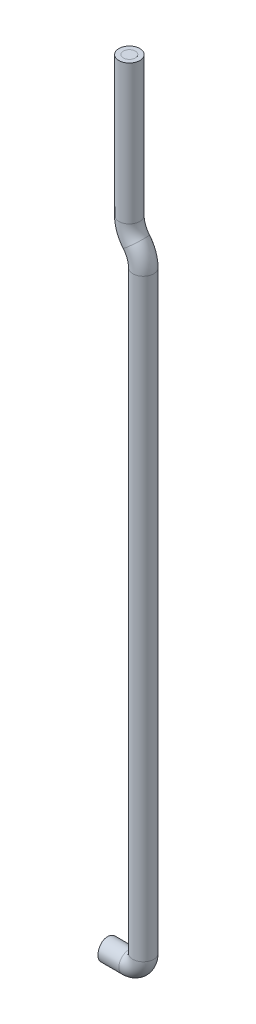
ISO-10303-21;
HEADER;
FILE_DESCRIPTION(('STEP AP214'),'2;1');
FILE_NAME('part.step','',(''),(''),'','','');
FILE_SCHEMA(('AUTOMOTIVE_DESIGN { 1 0 10303 214 1 1 1 1 }'));
ENDSEC;
DATA;
#1=APPLICATION_CONTEXT('core data for automotive mechanical design processes');
#2=APPLICATION_PROTOCOL_DEFINITION('international standard','automotive_design',2000,#1);
#3=PRODUCT_CONTEXT('',#1,'mechanical');
#4=PRODUCT('Part','Part','',(#3));
#5=PRODUCT_RELATED_PRODUCT_CATEGORY('part','',(#4));
#6=PRODUCT_DEFINITION_FORMATION('','',#4);
#7=PRODUCT_DEFINITION_CONTEXT('part definition',#1,'design');
#8=PRODUCT_DEFINITION('design','',#6,#7);
#9=PRODUCT_DEFINITION_SHAPE('','',#8);
#10=(LENGTH_UNIT() NAMED_UNIT(*) SI_UNIT(.MILLI.,.METRE.));
#11=(NAMED_UNIT(*) PLANE_ANGLE_UNIT() SI_UNIT($,.RADIAN.));
#12=(NAMED_UNIT(*) SI_UNIT($,.STERADIAN.) SOLID_ANGLE_UNIT());
#13=UNCERTAINTY_MEASURE_WITH_UNIT(LENGTH_MEASURE(1.E-05),#10,'distance_accuracy_value','');
#14=(GEOMETRIC_REPRESENTATION_CONTEXT(3) GLOBAL_UNCERTAINTY_ASSIGNED_CONTEXT((#13)) GLOBAL_UNIT_ASSIGNED_CONTEXT((#10,
#11,#12)) REPRESENTATION_CONTEXT('',''));
#15=CARTESIAN_POINT('',(0.,0.,0.));
#16=DIRECTION('',(0.,0.,1.));
#17=DIRECTION('',(1.,0.,0.));
#18=AXIS2_PLACEMENT_3D('',#15,#16,#17);
#19=CARTESIAN_POINT('',(-1.4,-1.4,0.));
#20=DIRECTION('',(-1.,0.,0.));
#21=DIRECTION('',(0.,-1.,0.));
#22=AXIS2_PLACEMENT_3D('',#19,#20,#21);
#23=CYLINDRICAL_SURFACE('',#22,0.6);
#24=CARTESIAN_POINT('',(-1.4,-1.4,0.));
#25=DIRECTION('',(-1.,0.,0.));
#26=DIRECTION('',(0.,0.,-1.));
#27=AXIS2_PLACEMENT_3D('',#24,#25,#26);
#28=CIRCLE('',#27,0.6);
#29=CARTESIAN_POINT('',(-1.4,-2.,0.));
#30=VERTEX_POINT('',#29);
#31=EDGE_CURVE('E74',#30,#30,#28,.T.);
#32=ORIENTED_EDGE('',*,*,#31,.T.);
#33=EDGE_LOOP('',(#32));
#34=FACE_BOUND('',#33,.T.);
#35=CARTESIAN_POINT('',(-3.6,-2.,0.));
#36=CARTESIAN_POINT('',(-3.59999938603146,-1.99999729292333,-0.0335918457265143));
#37=CARTESIAN_POINT('',(-3.59971478377764,-1.99716856482653,-0.067211954296975));
#38=CARTESIAN_POINT('',(-3.59860568944523,-1.98591814856572,-0.133551192087414));
#39=CARTESIAN_POINT('',(-3.59778006290974,-1.97748470752623,-0.166268277225901));
#40=CARTESIAN_POINT('',(-3.59568234677437,-1.95527324265569,-0.229786553121766));
#41=CARTESIAN_POINT('',(-3.59441069727381,-1.94150048582344,-0.260589597359059));
#42=CARTESIAN_POINT('',(-3.59156337422976,-1.90901102950739,-0.319432433360506));
#43=CARTESIAN_POINT('',(-3.58998783342366,-1.89029648724535,-0.347473423519698));
#44=CARTESIAN_POINT('',(-3.58670250528,-1.84837889093529,-0.400115063589076));
#45=CARTESIAN_POINT('',(-3.58499229287426,-1.82516125636204,-0.424704078066687));
#46=CARTESIAN_POINT('',(-3.58163382240315,-1.7749266019936,-0.4696445222726));
#47=CARTESIAN_POINT('',(-3.57998557023974,-1.74790922141375,-0.489995549149648));
#48=CARTESIAN_POINT('',(-3.57693354248889,-1.69077275458396,-0.525920460322328));
#49=CARTESIAN_POINT('',(-3.57553028796241,-1.66064726924697,-0.5414842153007));
#50=CARTESIAN_POINT('',(-3.57313221656801,-1.59819436570304,-0.567327921195507));
#51=CARTESIAN_POINT('',(-3.57213738604487,-1.56586702115494,-0.577608048767019));
#52=CARTESIAN_POINT('',(-3.57067250509072,-1.50004294873963,-0.59255941823305));
#53=CARTESIAN_POINT('',(-3.57020070322109,-1.46655051338077,-0.597249383602786));
#54=CARTESIAN_POINT('',(-3.56982985819532,-1.39925074185212,-0.60094517272453));
#55=CARTESIAN_POINT('',(-3.56993080099696,-1.36544341342298,-0.599951135833545));
#56=CARTESIAN_POINT('',(-3.57069243966251,-1.29860296605112,-0.592322585938023));
#57=CARTESIAN_POINT('',(-3.57135110155443,-1.26556748150734,-0.585708568398925));
#58=CARTESIAN_POINT('',(-3.57315079526416,-1.2010775098771,-0.567059594864202));
#59=CARTESIAN_POINT('',(-3.57429183798723,-1.16962305855133,-0.555024516313274));
#60=CARTESIAN_POINT('',(-3.5769301115438,-1.10912259469532,-0.525851938170344));
#61=CARTESIAN_POINT('',(-3.57842798827888,-1.08008107988233,-0.508705171649049));
#62=CARTESIAN_POINT('',(-3.58161044950285,-1.02528273385679,-0.46980418892808));
#63=CARTESIAN_POINT('',(-3.58329502402661,-0.999525727489062,-0.448050218584593));
#64=CARTESIAN_POINT('',(-3.58666992352064,-0.951910269980742,-0.400442064223917));
#65=CARTESIAN_POINT('',(-3.58836024277563,-0.930068720962396,-0.374570972770219));
#66=CARTESIAN_POINT('',(-3.59155027126064,-0.891025805738991,-0.319506886235191));
#67=CARTESIAN_POINT('',(-3.59304989199853,-0.873826589645823,-0.290312360763653));
#68=CARTESIAN_POINT('',(-3.59569027405106,-0.844558520129377,-0.229407979063294));
#69=CARTESIAN_POINT('',(-3.59683067670068,-0.832494790089496,-0.19769564820107));
#70=CARTESIAN_POINT('',(-3.59861914853772,-0.813895006647918,-0.132733635856682));
#71=CARTESIAN_POINT('',(-3.5992682616839,-0.807347228832553,-0.0994873743933913));
#72=CARTESIAN_POINT('',(-3.59987862644742,-0.801212274817144,-0.0440546787228873));
#73=CARTESIAN_POINT('',(-3.60000040271161,-0.799998224385904,-0.0220334190582219));
#74=CARTESIAN_POINT('',(-3.59999938603146,-0.800002707076675,0.0335918457265158));
#75=CARTESIAN_POINT('',(-3.59971478377764,-0.80283143517347,0.0672119542969765));
#76=CARTESIAN_POINT('',(-3.59860568944523,-0.81408185143428,0.133551192087415));
#77=CARTESIAN_POINT('',(-3.59778006290974,-0.822515292473776,0.166268277225902));
#78=CARTESIAN_POINT('',(-3.59568234677437,-0.844726757344313,0.229786553121768));
#79=CARTESIAN_POINT('',(-3.59441069727381,-0.85849951417656,0.260589597359061));
#80=CARTESIAN_POINT('',(-3.59156337422976,-0.890988970492612,0.319432433360507));
#81=CARTESIAN_POINT('',(-3.58998783342366,-0.909703512754649,0.347473423519699));
#82=CARTESIAN_POINT('',(-3.58670250528,-0.951621109064715,0.400115063589077));
#83=CARTESIAN_POINT('',(-3.58499229287426,-0.97483874363796,0.424704078066688));
#84=CARTESIAN_POINT('',(-3.58163382240315,-1.02507339800641,0.469644522272601));
#85=CARTESIAN_POINT('',(-3.57998557023974,-1.05209077858625,0.489995549149649));
#86=CARTESIAN_POINT('',(-3.57693354248889,-1.10922724541604,0.525920460322329));
#87=CARTESIAN_POINT('',(-3.57553028796241,-1.13935273075303,0.5414842153007));
#88=CARTESIAN_POINT('',(-3.57313221656801,-1.20180563429697,0.567327921195507));
#89=CARTESIAN_POINT('',(-3.57213738604487,-1.23413297884506,0.57760804876702));
#90=CARTESIAN_POINT('',(-3.57067250509072,-1.29995705126037,0.59255941823305));
#91=CARTESIAN_POINT('',(-3.57020070322109,-1.33344948661923,0.597249383602786));
#92=CARTESIAN_POINT('',(-3.56982985819532,-1.40074925814788,0.60094517272453));
#93=CARTESIAN_POINT('',(-3.56993080099696,-1.43455658657702,0.599951135833545));
#94=CARTESIAN_POINT('',(-3.57069243966251,-1.50139703394888,0.592322585938023));
#95=CARTESIAN_POINT('',(-3.57135110155443,-1.53443251849266,0.585708568398925));
#96=CARTESIAN_POINT('',(-3.57315079526416,-1.5989224901229,0.567059594864201));
#97=CARTESIAN_POINT('',(-3.57429183798723,-1.63037694144867,0.555024516313273));
#98=CARTESIAN_POINT('',(-3.5769301115438,-1.69087740530468,0.525851938170343));
#99=CARTESIAN_POINT('',(-3.57842798827888,-1.71991892011767,0.508705171649048));
#100=CARTESIAN_POINT('',(-3.58161044950285,-1.77471726614321,0.469804188928079));
#101=CARTESIAN_POINT('',(-3.58329502402661,-1.80047427251094,0.448050218584592));
#102=CARTESIAN_POINT('',(-3.58666992352064,-1.84808973001926,0.400442064223917));
#103=CARTESIAN_POINT('',(-3.58836024277563,-1.86993127903761,0.374570972770218));
#104=CARTESIAN_POINT('',(-3.59155027126064,-1.90897419426101,0.31950688623519));
#105=CARTESIAN_POINT('',(-3.59304989199853,-1.92617341035418,0.290312360763652));
#106=CARTESIAN_POINT('',(-3.59569027405106,-1.95544147987062,0.229407979063293));
#107=CARTESIAN_POINT('',(-3.59683067670068,-1.96750520991051,0.197695648201069));
#108=CARTESIAN_POINT('',(-3.59861914853772,-1.98610499335208,0.132733635856681));
#109=CARTESIAN_POINT('',(-3.5992682616839,-1.99265277116745,0.09948737439339));
#110=CARTESIAN_POINT('',(-3.59987862644742,-1.99878772518286,0.0440546787228869));
#111=CARTESIAN_POINT('',(-3.60000040271161,-2.0000017756141,0.0220334190582224));
#112=CARTESIAN_POINT('',(-3.6,-2.,0.));
#113=B_SPLINE_CURVE_WITH_KNOTS('',3,(#35,#36,#37,#38,#39,#40,#41,#42,#43,#44,#45,#46,#47,#48,
#49,#50,#51,#52,#53,#54,#55,#56,#57,#58,#59,#60,#61,#62,#63,#64,#65,#66,#67,#68,#69,#70,#71,#72,
#73,#74,#75,#76,#77,#78,#79,#80,#81,#82,#83,#84,#85,#86,#87,#88,#89,#90,#91,#92,#93,#94,#95,#96,
#97,#98,#99,#100,#101,#102,#103,#104,#105,#106,#107,#108,#109,#110,#111,#112),.UNSPECIFIED.,.T.,
.F.,(4,2,2,2,2,2,2,2,2,2,2,2,2,2,2,2,2,2,2,2,2,2,2,2,2,2,2,2,2,2,2,2,2,2,2,2,2,2,4),(0.,
0.100705430393277,0.201622705491087,0.302440682440186,0.403214722186349,0.504320675336556,
0.605436234953383,0.706764294654636,0.808088966289427,0.90907330266092,1.01005516316879,
1.11067032651546,1.21128776460885,1.31208873196716,1.4128843215951,1.5141050611402,
1.61537260127478,1.7167409348648,1.81789325775417,1.88394753078693,1.98465296118021,
2.08557023627802,2.18638821322712,2.28716225297328,2.38826820612349,2.48938376574032,
2.59071182544157,2.69203649707636,2.79302083344785,2.89400269395572,2.99461785730239,
3.09523529539579,3.19603626275409,3.29683185238204,3.39805259192713,3.49932013206171,
3.60068846565173,3.7018407885411,3.76789506157386),.UNSPECIFIED.);
#114=CARTESIAN_POINT('',(-3.6,-2.,0.));
#115=VERTEX_POINT('',#114);
#116=EDGE_CURVE('E11',#115,#115,#113,.T.);
#117=ORIENTED_EDGE('',*,*,#116,.T.);
#118=EDGE_LOOP('',(#117));
#119=FACE_BOUND('',#118,.T.);
#120=ADVANCED_FACE('F43',(#34,#119),#23,.T.);
#121=CARTESIAN_POINT('',(-1.4,77.4999999968516,0.));
#122=DIRECTION('',(0.,-1.,0.));
#123=DIRECTION('',(0.,0.,-1.));
#124=AXIS2_PLACEMENT_3D('',#121,#122,#123);
#125=PLANE('',#124);
#126=CARTESIAN_POINT('',(-1.4,77.4999999968516,0.));
#127=DIRECTION('',(0.,-1.,0.));
#128=DIRECTION('',(0.,0.,-1.));
#129=AXIS2_PLACEMENT_3D('',#126,#127,#128);
#130=CIRCLE('',#129,0.6);
#131=CARTESIAN_POINT('',(-1.4,77.4999999968516,-0.6));
#132=VERTEX_POINT('',#131);
#133=EDGE_CURVE('E55',#132,#132,#130,.T.);
#134=ORIENTED_EDGE('',*,*,#133,.F.);
#135=EDGE_LOOP('',(#134));
#136=FACE_BOUND('',#135,.T.);
#137=ADVANCED_FACE('F45',(#136),#125,.F.);
#138=CARTESIAN_POINT('',(0.,0.,0.));
#139=DIRECTION('',(0.,1.,0.));
#140=DIRECTION('',(0.,0.,1.));
#141=AXIS2_PLACEMENT_3D('',#138,#139,#140);
#142=CYLINDRICAL_SURFACE('',#141,0.6);
#143=CARTESIAN_POINT('',(0.,59.64772794,0.));
#144=DIRECTION('',(0.,-1.,0.));
#145=DIRECTION('',(0.,0.,-1.));
#146=AXIS2_PLACEMENT_3D('',#143,#144,#145);
#147=CIRCLE('',#146,0.6);
#148=CARTESIAN_POINT('',(0.599999999999999,59.64772794,0.));
#149=VERTEX_POINT('',#148);
#150=EDGE_CURVE('E68',#149,#149,#147,.T.);
#151=ORIENTED_EDGE('',*,*,#150,.T.);
#152=EDGE_LOOP('',(#151));
#153=FACE_BOUND('',#152,.T.);
#154=CARTESIAN_POINT('',(0.,0.,0.));
#155=DIRECTION('',(0.,-1.,0.));
#156=DIRECTION('',(0.,0.,-1.));
#157=AXIS2_PLACEMENT_3D('',#154,#155,#156);
#158=CIRCLE('',#157,0.6);
#159=CARTESIAN_POINT('',(0.6,0.,0.));
#160=VERTEX_POINT('',#159);
#161=EDGE_CURVE('E71',#160,#160,#158,.T.);
#162=ORIENTED_EDGE('',*,*,#161,.F.);
#163=EDGE_LOOP('',(#162));
#164=FACE_BOUND('',#163,.T.);
#165=ADVANCED_FACE('F87',(#153,#164),#142,.T.);
#166=CARTESIAN_POINT('',(-3.,59.64772794,0.));
#167=DIRECTION('',(0.,0.,1.));
#168=DIRECTION('',(1.,0.,0.));
#169=AXIS2_PLACEMENT_3D('',#166,#167,#168);
#170=TOROIDAL_SURFACE('',#169,3.,0.6);
#171=CARTESIAN_POINT('',(-0.699999999999999,61.5738639684258,0.));
#172=DIRECTION('',(0.642045342808607,-0.766666666666667,0.));
#173=DIRECTION('',(0.,0.,-1.));
#174=AXIS2_PLACEMENT_3D('',#171,#172,#173);
#175=CIRCLE('',#174,0.6);
#176=CARTESIAN_POINT('',(-0.239999999999998,61.959091174111,0.));
#177=VERTEX_POINT('',#176);
#178=EDGE_CURVE('E63',#177,#177,#175,.T.);
#179=CARTESIAN_POINT('',(-3.,59.64772794,0.));
#180=DIRECTION('',(0.,0.,1.));
#181=DIRECTION('',(1.,0.,0.));
#182=AXIS2_PLACEMENT_3D('',#179,#180,#181);
#183=CIRCLE('',#182,3.6);
#184=EDGE_CURVE('',#149,#177,#183,.T.);
#185=ORIENTED_EDGE('',*,*,#150,.F.);
#186=ORIENTED_EDGE('',*,*,#178,.T.);
#187=ORIENTED_EDGE('',*,*,#184,.T.);
#188=ORIENTED_EDGE('',*,*,#184,.F.);
#189=EDGE_LOOP('',(#185,#187,#186,#188));
#190=FACE_BOUND('',#189,.T.);
#191=ADVANCED_FACE('F89',(#190),#170,.T.);
#192=CARTESIAN_POINT('',(1.6,63.4999999968516,0.));
#193=DIRECTION('',(0.,0.,-1.));
#194=DIRECTION('',(-1.,0.,0.));
#195=AXIS2_PLACEMENT_3D('',#192,#193,#194);
#196=TOROIDAL_SURFACE('',#195,3.,0.6);
#197=CARTESIAN_POINT('',(-1.4,63.4999999968516,0.));
#198=DIRECTION('',(0.,-1.,0.));
#199=DIRECTION('',(0.,0.,-1.));
#200=AXIS2_PLACEMENT_3D('',#197,#198,#199);
#201=CIRCLE('',#200,0.6);
#202=CARTESIAN_POINT('',(-1.4,63.4999999968516,-0.6));
#203=VERTEX_POINT('',#202);
#204=EDGE_CURVE('E59',#203,#203,#201,.T.);
#205=ORIENTED_EDGE('',*,*,#204,.T.);
#206=EDGE_LOOP('',(#205));
#207=FACE_BOUND('',#206,.T.);
#208=ORIENTED_EDGE('',*,*,#178,.F.);
#209=EDGE_LOOP('',(#208));
#210=FACE_BOUND('',#209,.T.);
#211=ADVANCED_FACE('F96',(#207,#210),#196,.T.);
#212=CARTESIAN_POINT('',(-1.4,63.4999999968516,0.));
#213=DIRECTION('',(0.,1.,0.));
#214=DIRECTION('',(-1.,0.,0.));
#215=AXIS2_PLACEMENT_3D('',#212,#213,#214);
#216=CYLINDRICAL_SURFACE('',#215,0.6);
#217=ORIENTED_EDGE('',*,*,#133,.T.);
#218=EDGE_LOOP('',(#217));
#219=FACE_BOUND('',#218,.T.);
#220=ORIENTED_EDGE('',*,*,#204,.F.);
#221=EDGE_LOOP('',(#220));
#222=FACE_BOUND('',#221,.T.);
#223=ADVANCED_FACE('F83',(#219,#222),#216,.T.);
#224=CARTESIAN_POINT('',(-1.4,0.,0.));
#225=DIRECTION('',(0.,0.,-1.));
#226=DIRECTION('',(-1.,0.,0.));
#227=AXIS2_PLACEMENT_3D('',#224,#225,#226);
#228=TOROIDAL_SURFACE('',#227,1.4,0.6);
#229=CARTESIAN_POINT('',(-1.4,0.,0.));
#230=DIRECTION('',(0.,0.,-1.));
#231=DIRECTION('',(-1.,0.,0.));
#232=AXIS2_PLACEMENT_3D('',#229,#230,#231);
#233=CIRCLE('',#232,2.);
#234=EDGE_CURVE('',#160,#30,#233,.T.);
#235=ORIENTED_EDGE('',*,*,#161,.T.);
#236=ORIENTED_EDGE('',*,*,#31,.F.);
#237=ORIENTED_EDGE('',*,*,#234,.T.);
#238=ORIENTED_EDGE('',*,*,#234,.F.);
#239=EDGE_LOOP('',(#235,#237,#236,#238));
#240=FACE_BOUND('',#239,.T.);
#241=ADVANCED_FACE('F79',(#240),#228,.T.);
#242=CARTESIAN_POINT('',(2.4,0.549999999999999,0.));
#243=DIRECTION('',(0.,-1.,0.));
#244=DIRECTION('',(1.,0.,0.));
#245=AXIS2_PLACEMENT_3D('',#242,#243,#244);
#246=CYLINDRICAL_SURFACE('',#245,6.);
#247=ORIENTED_EDGE('',*,*,#116,.F.);
#248=EDGE_LOOP('',(#247));
#249=FACE_BOUND('',#248,.T.);
#250=ADVANCED_FACE('F82',(#249),#246,.T.);
#251=CLOSED_SHELL('',(#120,#137,#165,#191,#211,#223,#241,#250));
#252=MANIFOLD_SOLID_BREP('B2',#251);
#253=CARTESIAN_POINT('',(-1.4,-1.4,0.));
#254=DIRECTION('',(-1.,0.,0.));
#255=DIRECTION('',(0.,-1.,0.));
#256=AXIS2_PLACEMENT_3D('',#253,#254,#255);
#257=CYLINDRICAL_SURFACE('',#256,1.05);
#258=CARTESIAN_POINT('',(-1.4,-1.4,0.));
#259=DIRECTION('',(-1.,0.,0.));
#260=DIRECTION('',(0.,0.,-1.));
#261=AXIS2_PLACEMENT_3D('',#258,#259,#260);
#262=CIRCLE('',#261,1.05);
#263=CARTESIAN_POINT('',(-1.4,-2.45,0.));
#264=VERTEX_POINT('',#263);
#265=EDGE_CURVE('E211',#264,#264,#262,.T.);
#266=ORIENTED_EDGE('',*,*,#265,.T.);
#267=EDGE_LOOP('',(#266));
#268=FACE_BOUND('',#267,.T.);
#269=CARTESIAN_POINT('',(-3.6,-2.45,0.));
#270=CARTESIAN_POINT('',(-3.59999882654764,-2.44999728144867,-0.0584420204428067));
#271=CARTESIAN_POINT('',(-3.59913650732618,-2.44510000910616,-0.116958132425666));
#272=CARTESIAN_POINT('',(-3.59577722267333,-2.42563787265427,-0.232390779304183));
#273=CARTESIAN_POINT('',(-3.59327695859125,-2.41105349890432,-0.289303844077928));
#274=CARTESIAN_POINT('',(-3.58692199180402,-2.372672010416,-0.399777511579261));
#275=CARTESIAN_POINT('',(-3.58306903010429,-2.34888673381991,-0.453342319817158));
#276=CARTESIAN_POINT('',(-3.57443219380795,-2.29280692209552,-0.555699045634291));
#277=CARTESIAN_POINT('',(-3.5696486570959,-2.26051547398982,-0.604492685953902));
#278=CARTESIAN_POINT('',(-3.55962263242419,-2.18797278745103,-0.696463405273728));
#279=CARTESIAN_POINT('',(-3.55437621501589,-2.14764882283901,-0.739582703296023));
#280=CARTESIAN_POINT('',(-3.54404526339027,-2.06034040782813,-0.818482226810395));
#281=CARTESIAN_POINT('',(-3.53896074840682,-2.01335516966361,-0.854261583050794));
#282=CARTESIAN_POINT('',(-3.52949202998072,-1.91366364465653,-0.917694608774674));
#283=CARTESIAN_POINT('',(-3.52511282919395,-1.86092059142462,-0.945291308382155));
#284=CARTESIAN_POINT('',(-3.51760474008986,-1.75145827462108,-0.991210841917993));
#285=CARTESIAN_POINT('',(-3.51447574761267,-1.69473934275885,-1.0095344484589));
#286=CARTESIAN_POINT('',(-3.50986115542547,-1.57954282817136,-1.03620668485384));
#287=CARTESIAN_POINT('',(-3.5083592501825,-1.52108884235882,-1.04465435357991));
#288=CARTESIAN_POINT('',(-3.50711962872806,-1.40357521569552,-1.05164211226404));
#289=CARTESIAN_POINT('',(-3.50738177772354,-1.34451562146419,-1.05018295921163));
#290=CARTESIAN_POINT('',(-3.50962576963407,-1.22817892307427,-1.03747905088222));
#291=CARTESIAN_POINT('',(-3.51158795307566,-1.17088916864427,-1.02634615998595));
#292=CARTESIAN_POINT('',(-3.51698013671817,-1.05900290273248,-0.994786430854397));
#293=CARTESIAN_POINT('',(-3.5204102037736,-1.00440651404589,-0.974359169305901));
#294=CARTESIAN_POINT('',(-3.528372773444,-0.899123656399449,-0.924677939988588));
#295=CARTESIAN_POINT('',(-3.53291102606906,-0.848459458162703,-0.895377736596716));
#296=CARTESIAN_POINT('',(-3.54257425888111,-0.752728317622276,-0.828817510782035));
#297=CARTESIAN_POINT('',(-3.54769924636775,-0.707661444970162,-0.791557389323903));
#298=CARTESIAN_POINT('',(-3.55804394565978,-0.623760548003455,-0.709535297831805));
#299=CARTESIAN_POINT('',(-3.56326400197189,-0.585018921961036,-0.664678807417909));
#300=CARTESIAN_POINT('',(-3.57314929955695,-0.51558044588738,-0.569030028255324));
#301=CARTESIAN_POINT('',(-3.57781429323867,-0.484887178613202,-0.518235110491178));
#302=CARTESIAN_POINT('',(-3.58607198078178,-0.432408705294869,-0.41204722832548));
#303=CARTESIAN_POINT('',(-3.58966274845476,-0.410639475324484,-0.356646229329763));
#304=CARTESIAN_POINT('',(-3.59534708225393,-0.376784906318021,-0.242969833236207));
#305=CARTESIAN_POINT('',(-3.59744380052951,-0.364679172679017,-0.184700766731595));
#306=CARTESIAN_POINT('',(-3.5991178906655,-0.355050834919473,-0.105003930626633));
#307=CARTESIAN_POINT('',(-3.59944796804276,-0.353158320413337,-0.0840519549830509));
#308=CARTESIAN_POINT('',(-3.59988923404206,-0.350632412998741,-0.0420698538801489));
#309=CARTESIAN_POINT('',(-3.60000042245492,-0.349999021293564,-0.021039728346164));
#310=CARTESIAN_POINT('',(-3.59999882654764,-0.350002718551328,0.0584420204428078));
#311=CARTESIAN_POINT('',(-3.59913650732618,-0.354899990893835,0.116958132425667));
#312=CARTESIAN_POINT('',(-3.59577722267333,-0.374362127345728,0.232390779304184));
#313=CARTESIAN_POINT('',(-3.59327695859125,-0.388946501095684,0.28930384407793));
#314=CARTESIAN_POINT('',(-3.58692199180402,-0.427327989583997,0.399777511579262));
#315=CARTESIAN_POINT('',(-3.58306903010429,-0.451113266180095,0.453342319817159));
#316=CARTESIAN_POINT('',(-3.57443219380795,-0.50719307790448,0.555699045634292));
#317=CARTESIAN_POINT('',(-3.5696486570959,-0.539484526010179,0.604492685953903));
#318=CARTESIAN_POINT('',(-3.55962263242419,-0.61202721254897,0.69646340527373));
#319=CARTESIAN_POINT('',(-3.55437621501589,-0.652351177160994,0.739582703296024));
#320=CARTESIAN_POINT('',(-3.54404526339027,-0.739659592171874,0.818482226810396));
#321=CARTESIAN_POINT('',(-3.53896074840682,-0.786644830336394,0.854261583050795));
#322=CARTESIAN_POINT('',(-3.52949202998072,-0.886336355343475,0.917694608774675));
#323=CARTESIAN_POINT('',(-3.52511282919395,-0.939079408575379,0.945291308382156));
#324=CARTESIAN_POINT('',(-3.51760474008986,-1.04854172537893,0.991210841917993));
#325=CARTESIAN_POINT('',(-3.51447574761267,-1.10526065724115,1.0095344484589));
#326=CARTESIAN_POINT('',(-3.50986115542547,-1.22045717182864,1.03620668485384));
#327=CARTESIAN_POINT('',(-3.5083592501825,-1.27891115764118,1.04465435357991));
#328=CARTESIAN_POINT('',(-3.50711962872806,-1.39642478430449,1.05164211226404));
#329=CARTESIAN_POINT('',(-3.50738177772354,-1.45548437853581,1.05018295921163));
#330=CARTESIAN_POINT('',(-3.50962576963407,-1.57182107692573,1.03747905088222));
#331=CARTESIAN_POINT('',(-3.51158795307566,-1.62911083135573,1.02634615998595));
#332=CARTESIAN_POINT('',(-3.51698013671817,-1.74099709726753,0.994786430854397));
#333=CARTESIAN_POINT('',(-3.5204102037736,-1.79559348595411,0.9743591693059));
#334=CARTESIAN_POINT('',(-3.528372773444,-1.90087634360055,0.924677939988588));
#335=CARTESIAN_POINT('',(-3.53291102606906,-1.9515405418373,0.895377736596715));
#336=CARTESIAN_POINT('',(-3.54257425888112,-2.04727168237773,0.828817510782033));
#337=CARTESIAN_POINT('',(-3.54769924636775,-2.09233855502984,0.791557389323901));
#338=CARTESIAN_POINT('',(-3.55804394565978,-2.17623945199655,0.709535297831804));
#339=CARTESIAN_POINT('',(-3.56326400197189,-2.21498107803897,0.664678807417908));
#340=CARTESIAN_POINT('',(-3.57314929955695,-2.28441955411262,0.569030028255323));
#341=CARTESIAN_POINT('',(-3.57781429323867,-2.3151128213868,0.518235110491176));
#342=CARTESIAN_POINT('',(-3.58607198078178,-2.36759129470513,0.412047228325478));
#343=CARTESIAN_POINT('',(-3.58966274845476,-2.38936052467552,0.356646229329762));
#344=CARTESIAN_POINT('',(-3.59534708225393,-2.42321509368198,0.242969833236205));
#345=CARTESIAN_POINT('',(-3.59744380052951,-2.43532082732098,0.184700766731594));
#346=CARTESIAN_POINT('',(-3.5991178906655,-2.44494916508053,0.105003930626631));
#347=CARTESIAN_POINT('',(-3.59944796804276,-2.44684167958666,0.0840519549830501));
#348=CARTESIAN_POINT('',(-3.59988923404206,-2.44936758700126,0.0420698538801492));
#349=CARTESIAN_POINT('',(-3.60000042245492,-2.45000097870644,0.0210397283461647));
#350=CARTESIAN_POINT('',(-3.6,-2.45,0.));
#351=B_SPLINE_CURVE_WITH_KNOTS('',3,(#269,#270,#271,#272,#273,#274,#275,#276,#277,#278,#279,
#280,#281,#282,#283,#284,#285,#286,#287,#288,#289,#290,#291,#292,#293,#294,#295,#296,#297,#298,
#299,#300,#301,#302,#303,#304,#305,#306,#307,#308,#309,#310,#311,#312,#313,#314,#315,#316,#317,
#318,#319,#320,#321,#322,#323,#324,#325,#326,#327,#328,#329,#330,#331,#332,#333,#334,#335,#336,
#337,#338,#339,#340,#341,#342,#343,#344,#345,#346,#347,#348,#349,#350),.UNSPECIFIED.,.T.,.F.,(4,
2,2,2,2,2,2,2,2,2,2,2,2,2,2,2,2,2,2,2,2,2,2,2,2,2,2,2,2,2,2,2,2,2,2,2,2,2,2,2,4),(0.,
0.175245722203911,0.350845460530019,0.526220014716118,0.701531010212524,0.878507996493277,
1.05550592964953,1.23370869761883,1.41189661570247,1.5882818526004,1.76465361188897,
1.93901259767118,2.11337952544915,2.28867116259157,2.46396498079603,2.64162623925306,
2.81936645053747,2.99742348242234,3.17510372779785,3.23819392963313,3.30128419176064,
3.47652991396455,3.65212965229065,3.82750420647675,4.00281520197316,4.17979218825391,
4.35679012141016,4.53499288937946,4.7131808074631,4.88956604436103,5.06593780364961,
5.24029678943182,5.41466371720979,5.58995535435221,5.76524917255667,5.94291043101369,
6.12065064229811,6.29870767418297,6.47638791955849,6.53947812139377,6.60256838352127),.UNSPECIFIED.);
#352=CARTESIAN_POINT('',(-3.6,-2.45,0.));
#353=VERTEX_POINT('',#352);
#354=EDGE_CURVE('E215',#353,#353,#351,.T.);
#355=ORIENTED_EDGE('',*,*,#354,.T.);
#356=EDGE_LOOP('',(#355));
#357=FACE_BOUND('',#356,.T.);
#358=ADVANCED_FACE('F167',(#268,#357),#257,.T.);
#359=CARTESIAN_POINT('',(-1.4,-1.4,0.));
#360=DIRECTION('',(-1.,0.,0.));
#361=DIRECTION('',(0.,-1.,0.));
#362=AXIS2_PLACEMENT_3D('',#359,#360,#361);
#363=CYLINDRICAL_SURFACE('',#362,0.6);
#364=CARTESIAN_POINT('',(-1.4,-1.4,0.));
#365=DIRECTION('',(-1.,0.,0.));
#366=DIRECTION('',(0.,0.,-1.));
#367=AXIS2_PLACEMENT_3D('',#364,#365,#366);
#368=CIRCLE('',#367,0.6);
#369=CARTESIAN_POINT('',(-1.4,-2.,0.));
#370=VERTEX_POINT('',#369);
#371=EDGE_CURVE('E210',#370,#370,#368,.F.);
#372=ORIENTED_EDGE('',*,*,#371,.T.);
#373=EDGE_LOOP('',(#372));
#374=FACE_BOUND('',#373,.T.);
#375=CARTESIAN_POINT('',(-3.6,-0.800000000000001,0.));
#376=CARTESIAN_POINT('',(-3.59999938603146,-0.800002707076675,-0.0335918457265143));
#377=CARTESIAN_POINT('',(-3.59971478377764,-0.80283143517347,-0.0672119542969751));
#378=CARTESIAN_POINT('',(-3.59860568944523,-0.814081851434279,-0.133551192087414));
#379=CARTESIAN_POINT('',(-3.59778006290974,-0.822515292473775,-0.166268277225901));
#380=CARTESIAN_POINT('',(-3.59568234677437,-0.844726757344312,-0.229786553121766));
#381=CARTESIAN_POINT('',(-3.59441069727381,-0.85849951417656,-0.260589597359059));
#382=CARTESIAN_POINT('',(-3.59156337422976,-0.890988970492611,-0.319432433360506));
#383=CARTESIAN_POINT('',(-3.58998783342366,-0.909703512754648,-0.347473423519698));
#384=CARTESIAN_POINT('',(-3.58670250528,-0.951621109064714,-0.400115063589076));
#385=CARTESIAN_POINT('',(-3.58499229287426,-0.974838743637959,-0.424704078066687));
#386=CARTESIAN_POINT('',(-3.58163382240315,-1.0250733980064,-0.4696445222726));
#387=CARTESIAN_POINT('',(-3.57998557023974,-1.05209077858625,-0.489995549149648));
#388=CARTESIAN_POINT('',(-3.57693354248889,-1.10922724541604,-0.525920460322328));
#389=CARTESIAN_POINT('',(-3.57553028796241,-1.13935273075303,-0.5414842153007));
#390=CARTESIAN_POINT('',(-3.57313221656801,-1.20180563429697,-0.567327921195507));
#391=CARTESIAN_POINT('',(-3.57213738604487,-1.23413297884506,-0.577608048767019));
#392=CARTESIAN_POINT('',(-3.57067250509072,-1.29995705126037,-0.59255941823305));
#393=CARTESIAN_POINT('',(-3.57020070322109,-1.33344948661923,-0.597249383602786));
#394=CARTESIAN_POINT('',(-3.56982985819532,-1.40074925814788,-0.60094517272453));
#395=CARTESIAN_POINT('',(-3.56993080099696,-1.43455658657702,-0.599951135833545));
#396=CARTESIAN_POINT('',(-3.57069243966251,-1.50139703394888,-0.592322585938023));
#397=CARTESIAN_POINT('',(-3.57135110155443,-1.53443251849266,-0.585708568398925));
#398=CARTESIAN_POINT('',(-3.57315079526416,-1.5989224901229,-0.567059594864202));
#399=CARTESIAN_POINT('',(-3.57429183798723,-1.63037694144867,-0.555024516313274));
#400=CARTESIAN_POINT('',(-3.5769301115438,-1.69087740530468,-0.525851938170344));
#401=CARTESIAN_POINT('',(-3.57842798827888,-1.71991892011767,-0.508705171649049));
#402=CARTESIAN_POINT('',(-3.58161044950285,-1.77471726614321,-0.46980418892808));
#403=CARTESIAN_POINT('',(-3.58329502402661,-1.80047427251094,-0.448050218584593));
#404=CARTESIAN_POINT('',(-3.58666992352064,-1.84808973001926,-0.400442064223918));
#405=CARTESIAN_POINT('',(-3.58836024277563,-1.8699312790376,-0.374570972770219));
#406=CARTESIAN_POINT('',(-3.59155027126064,-1.90897419426101,-0.319506886235192));
#407=CARTESIAN_POINT('',(-3.59304989199853,-1.92617341035418,-0.290312360763654));
#408=CARTESIAN_POINT('',(-3.59569027405106,-1.95544147987062,-0.229407979063294));
#409=CARTESIAN_POINT('',(-3.59683067670068,-1.96750520991051,-0.197695648201071));
#410=CARTESIAN_POINT('',(-3.59861914853772,-1.98610499335208,-0.132733635856682));
#411=CARTESIAN_POINT('',(-3.5992682616839,-1.99265277116745,-0.0994873743933916));
#412=CARTESIAN_POINT('',(-3.59987862644742,-1.99878772518286,-0.0440546787228877));
#413=CARTESIAN_POINT('',(-3.60000040271161,-2.0000017756141,-0.0220334190582225));
#414=CARTESIAN_POINT('',(-3.59999938603146,-1.99999729292333,0.0335918457265151));
#415=CARTESIAN_POINT('',(-3.59971478377764,-1.99716856482653,0.067211954296976));
#416=CARTESIAN_POINT('',(-3.59860568944523,-1.98591814856572,0.133551192087415));
#417=CARTESIAN_POINT('',(-3.59778006290974,-1.97748470752622,0.166268277225902));
#418=CARTESIAN_POINT('',(-3.59568234677437,-1.95527324265569,0.229786553121768));
#419=CARTESIAN_POINT('',(-3.59441069727381,-1.94150048582344,0.260589597359061));
#420=CARTESIAN_POINT('',(-3.59156337422976,-1.90901102950739,0.319432433360507));
#421=CARTESIAN_POINT('',(-3.58998783342366,-1.89029648724535,0.347473423519699));
#422=CARTESIAN_POINT('',(-3.58670250528,-1.84837889093529,0.400115063589077));
#423=CARTESIAN_POINT('',(-3.58499229287426,-1.82516125636204,0.424704078066688));
#424=CARTESIAN_POINT('',(-3.58163382240315,-1.7749266019936,0.469644522272601));
#425=CARTESIAN_POINT('',(-3.57998557023974,-1.74790922141375,0.489995549149649));
#426=CARTESIAN_POINT('',(-3.57693354248889,-1.69077275458396,0.525920460322329));
#427=CARTESIAN_POINT('',(-3.57553028796241,-1.66064726924697,0.5414842153007));
#428=CARTESIAN_POINT('',(-3.57313221656801,-1.59819436570303,0.567327921195507));
#429=CARTESIAN_POINT('',(-3.57213738604487,-1.56586702115494,0.57760804876702));
#430=CARTESIAN_POINT('',(-3.57067250509072,-1.50004294873963,0.59255941823305));
#431=CARTESIAN_POINT('',(-3.57020070322109,-1.46655051338077,0.597249383602786));
#432=CARTESIAN_POINT('',(-3.56982985819532,-1.39925074185212,0.60094517272453));
#433=CARTESIAN_POINT('',(-3.56993080099696,-1.36544341342298,0.599951135833545));
#434=CARTESIAN_POINT('',(-3.57069243966251,-1.29860296605112,0.592322585938023));
#435=CARTESIAN_POINT('',(-3.57135110155443,-1.26556748150734,0.585708568398925));
#436=CARTESIAN_POINT('',(-3.57315079526416,-1.2010775098771,0.567059594864201));
#437=CARTESIAN_POINT('',(-3.57429183798723,-1.16962305855133,0.555024516313273));
#438=CARTESIAN_POINT('',(-3.5769301115438,-1.10912259469532,0.525851938170343));
#439=CARTESIAN_POINT('',(-3.57842798827888,-1.08008107988233,0.508705171649048));
#440=CARTESIAN_POINT('',(-3.58161044950285,-1.02528273385679,0.469804188928079));
#441=CARTESIAN_POINT('',(-3.58329502402661,-0.999525727489061,0.448050218584592));
#442=CARTESIAN_POINT('',(-3.58666992352064,-0.951910269980741,0.400442064223916));
#443=CARTESIAN_POINT('',(-3.58836024277563,-0.930068720962395,0.374570972770218));
#444=CARTESIAN_POINT('',(-3.59155027126064,-0.89102580573899,0.31950688623519));
#445=CARTESIAN_POINT('',(-3.59304989199853,-0.873826589645823,0.290312360763652));
#446=CARTESIAN_POINT('',(-3.59569027405106,-0.844558520129376,0.229407979063293));
#447=CARTESIAN_POINT('',(-3.59683067670068,-0.832494790089495,0.197695648201069));
#448=CARTESIAN_POINT('',(-3.59861914853772,-0.813895006647918,0.132733635856681));
#449=CARTESIAN_POINT('',(-3.5992682616839,-0.807347228832552,0.0994873743933901));
#450=CARTESIAN_POINT('',(-3.59987862644742,-0.801212274817144,0.044054678722887));
#451=CARTESIAN_POINT('',(-3.60000040271161,-0.799998224385905,0.0220334190582224));
#452=CARTESIAN_POINT('',(-3.6,-0.800000000000001,0.));
#453=B_SPLINE_CURVE_WITH_KNOTS('',3,(#375,#376,#377,#378,#379,#380,#381,#382,#383,#384,#385,
#386,#387,#388,#389,#390,#391,#392,#393,#394,#395,#396,#397,#398,#399,#400,#401,#402,#403,#404,
#405,#406,#407,#408,#409,#410,#411,#412,#413,#414,#415,#416,#417,#418,#419,#420,#421,#422,#423,
#424,#425,#426,#427,#428,#429,#430,#431,#432,#433,#434,#435,#436,#437,#438,#439,#440,#441,#442,
#443,#444,#445,#446,#447,#448,#449,#450,#451,#452),.UNSPECIFIED.,.T.,.F.,(4,2,2,2,2,2,2,2,2,2,2,
2,2,2,2,2,2,2,2,2,2,2,2,2,2,2,2,2,2,2,2,2,2,2,2,2,2,2,4),(0.,0.100705430393277,
0.201622705491087,0.302440682440186,0.403214722186349,0.504320675336555,0.605436234953383,
0.706764294654636,0.808088966289427,0.90907330266092,1.01005516316879,1.11067032651546,
1.21128776460885,1.31208873196716,1.4128843215951,1.51410506114019,1.61537260127478,
1.7167409348648,1.81789325775417,1.88394753078693,1.98465296118021,2.08557023627802,
2.18638821322712,2.28716225297328,2.38826820612349,2.48938376574032,2.59071182544157,
2.69203649707636,2.79302083344785,2.89400269395572,2.99461785730239,3.09523529539579,
3.1960362627541,3.29683185238204,3.39805259192713,3.49932013206171,3.60068846565173,
3.7018407885411,3.76789506157386),.UNSPECIFIED.);
#454=CARTESIAN_POINT('',(-3.6,-0.800000000000001,0.));
#455=VERTEX_POINT('',#454);
#456=EDGE_CURVE('E42',#455,#455,#453,.T.);
#457=ORIENTED_EDGE('',*,*,#456,.T.);
#458=EDGE_LOOP('',(#457));
#459=FACE_BOUND('',#458,.T.);
#460=ADVANCED_FACE('F239',(#374,#459),#363,.F.);
#461=CARTESIAN_POINT('',(-1.4,77.4999999968516,0.));
#462=DIRECTION('',(0.,1.,0.));
#463=DIRECTION('',(0.,0.,1.));
#464=AXIS2_PLACEMENT_3D('',#461,#462,#463);
#465=PLANE('',#464);
#466=CARTESIAN_POINT('',(-1.4,77.4999999968516,0.));
#467=DIRECTION('',(0.,1.,0.));
#468=DIRECTION('',(0.,0.,1.));
#469=AXIS2_PLACEMENT_3D('',#466,#467,#468);
#470=CIRCLE('',#469,0.6);
#471=CARTESIAN_POINT('',(-1.4,77.4999999968516,0.6));
#472=VERTEX_POINT('',#471);
#473=EDGE_CURVE('E195',#472,#472,#470,.T.);
#474=ORIENTED_EDGE('',*,*,#473,.F.);
#475=EDGE_LOOP('',(#474));
#476=FACE_BOUND('',#475,.T.);
#477=CARTESIAN_POINT('',(-1.4,77.4999999968516,0.));
#478=DIRECTION('',(0.,1.,0.));
#479=DIRECTION('',(0.,0.,1.));
#480=AXIS2_PLACEMENT_3D('',#477,#478,#479);
#481=CIRCLE('',#480,1.05);
#482=CARTESIAN_POINT('',(-1.4,77.4999999968516,1.05));
#483=VERTEX_POINT('',#482);
#484=EDGE_CURVE('E179',#483,#483,#481,.T.);
#485=ORIENTED_EDGE('',*,*,#484,.T.);
#486=EDGE_LOOP('',(#485));
#487=FACE_BOUND('',#486,.T.);
#488=ADVANCED_FACE('F169',(#476,#487),#465,.T.);
#489=CARTESIAN_POINT('',(0.,0.,0.));
#490=DIRECTION('',(0.,1.,0.));
#491=DIRECTION('',(0.,0.,1.));
#492=AXIS2_PLACEMENT_3D('',#489,#490,#491);
#493=CYLINDRICAL_SURFACE('',#492,1.05);
#494=CARTESIAN_POINT('',(0.,59.64772794,0.));
#495=DIRECTION('',(0.,1.,0.));
#496=DIRECTION('',(0.,0.,1.));
#497=AXIS2_PLACEMENT_3D('',#494,#495,#496);
#498=CIRCLE('',#497,1.05);
#499=CARTESIAN_POINT('',(1.05,59.64772794,0.));
#500=VERTEX_POINT('',#499);
#501=EDGE_CURVE('E192',#500,#500,#498,.T.);
#502=ORIENTED_EDGE('',*,*,#501,.F.);
#503=EDGE_LOOP('',(#502));
#504=FACE_BOUND('',#503,.T.);
#505=CARTESIAN_POINT('',(0.,0.,0.));
#506=DIRECTION('',(0.,-1.,0.));
#507=DIRECTION('',(0.,0.,-1.));
#508=AXIS2_PLACEMENT_3D('',#505,#506,#507);
#509=CIRCLE('',#508,1.05);
#510=CARTESIAN_POINT('',(1.05,0.,0.));
#511=VERTEX_POINT('',#510);
#512=EDGE_CURVE('E214',#511,#511,#509,.T.);
#513=ORIENTED_EDGE('',*,*,#512,.F.);
#514=EDGE_LOOP('',(#513));
#515=FACE_BOUND('',#514,.T.);
#516=ADVANCED_FACE('F274',(#504,#515),#493,.T.);
#517=CARTESIAN_POINT('',(-3.,59.64772794,0.));
#518=DIRECTION('',(0.,0.,1.));
#519=DIRECTION('',(1.,0.,0.));
#520=AXIS2_PLACEMENT_3D('',#517,#518,#519);
#521=TOROIDAL_SURFACE('',#520,3.,1.05);
#522=CARTESIAN_POINT('',(-0.699999999999999,61.5738639684258,0.));
#523=DIRECTION('',(-0.642045342808607,0.766666666666667,0.));
#524=DIRECTION('',(0.,0.,1.));
#525=AXIS2_PLACEMENT_3D('',#522,#523,#524);
#526=CIRCLE('',#525,1.05);
#527=CARTESIAN_POINT('',(0.105000000000002,62.2480115783749,0.));
#528=VERTEX_POINT('',#527);
#529=EDGE_CURVE('E187',#528,#528,#526,.T.);
#530=CARTESIAN_POINT('',(-3.,59.64772794,0.));
#531=DIRECTION('',(0.,0.,1.));
#532=DIRECTION('',(1.,0.,0.));
#533=AXIS2_PLACEMENT_3D('',#530,#531,#532);
#534=CIRCLE('',#533,4.05);
#535=EDGE_CURVE('',#500,#528,#534,.T.);
#536=ORIENTED_EDGE('',*,*,#501,.T.);
#537=ORIENTED_EDGE('',*,*,#529,.F.);
#538=ORIENTED_EDGE('',*,*,#535,.T.);
#539=ORIENTED_EDGE('',*,*,#535,.F.);
#540=EDGE_LOOP('',(#536,#538,#537,#539));
#541=FACE_BOUND('',#540,.T.);
#542=ADVANCED_FACE('F283',(#541),#521,.T.);
#543=CARTESIAN_POINT('',(1.6,63.4999999968516,0.));
#544=DIRECTION('',(0.,0.,-1.));
#545=DIRECTION('',(-1.,0.,0.));
#546=AXIS2_PLACEMENT_3D('',#543,#544,#545);
#547=TOROIDAL_SURFACE('',#546,3.,1.05);
#548=CARTESIAN_POINT('',(-1.4,63.4999999968516,0.));
#549=DIRECTION('',(0.,1.,0.));
#550=DIRECTION('',(0.,0.,1.));
#551=AXIS2_PLACEMENT_3D('',#548,#549,#550);
#552=CIRCLE('',#551,1.05);
#553=CARTESIAN_POINT('',(-1.4,63.4999999968516,1.05));
#554=VERTEX_POINT('',#553);
#555=EDGE_CURVE('E183',#554,#554,#552,.T.);
#556=ORIENTED_EDGE('',*,*,#555,.F.);
#557=EDGE_LOOP('',(#556));
#558=FACE_BOUND('',#557,.T.);
#559=ORIENTED_EDGE('',*,*,#529,.T.);
#560=EDGE_LOOP('',(#559));
#561=FACE_BOUND('',#560,.T.);
#562=ADVANCED_FACE('F291',(#558,#561),#547,.T.);
#563=CARTESIAN_POINT('',(-1.4,63.4999999968516,0.));
#564=DIRECTION('',(0.,1.,0.));
#565=DIRECTION('',(-1.,0.,0.));
#566=AXIS2_PLACEMENT_3D('',#563,#564,#565);
#567=CYLINDRICAL_SURFACE('',#566,1.05);
#568=ORIENTED_EDGE('',*,*,#484,.F.);
#569=EDGE_LOOP('',(#568));
#570=FACE_BOUND('',#569,.T.);
#571=ORIENTED_EDGE('',*,*,#555,.T.);
#572=EDGE_LOOP('',(#571));
#573=FACE_BOUND('',#572,.T.);
#574=ADVANCED_FACE('F243',(#570,#573),#567,.T.);
#575=CARTESIAN_POINT('',(-1.4,63.4999999968516,0.));
#576=DIRECTION('',(0.,1.,0.));
#577=DIRECTION('',(-1.,0.,0.));
#578=AXIS2_PLACEMENT_3D('',#575,#576,#577);
#579=CYLINDRICAL_SURFACE('',#578,0.6);
#580=CARTESIAN_POINT('',(-1.4,63.4999999968516,0.));
#581=DIRECTION('',(0.,-1.,0.));
#582=DIRECTION('',(0.,0.,-1.));
#583=AXIS2_PLACEMENT_3D('',#580,#581,#582);
#584=CIRCLE('',#583,0.6);
#585=CARTESIAN_POINT('',(-1.4,63.4999999968516,-0.6));
#586=VERTEX_POINT('',#585);
#587=EDGE_CURVE('E198',#586,#586,#584,.T.);
#588=ORIENTED_EDGE('',*,*,#587,.T.);
#589=EDGE_LOOP('',(#588));
#590=FACE_BOUND('',#589,.T.);
#591=ORIENTED_EDGE('',*,*,#473,.T.);
#592=EDGE_LOOP('',(#591));
#593=FACE_BOUND('',#592,.T.);
#594=ADVANCED_FACE('F252',(#590,#593),#579,.F.);
#595=CARTESIAN_POINT('',(0.,-1.,0.));
#596=DIRECTION('',(0.,1.,0.));
#597=DIRECTION('',(0.,0.,1.));
#598=AXIS2_PLACEMENT_3D('',#595,#596,#597);
#599=CYLINDRICAL_SURFACE('',#598,0.6);
#600=CARTESIAN_POINT('',(0.,0.,0.));
#601=DIRECTION('',(0.,1.,0.));
#602=DIRECTION('',(0.,0.,1.));
#603=AXIS2_PLACEMENT_3D('',#600,#601,#602);
#604=CIRCLE('',#603,0.6);
#605=CARTESIAN_POINT('',(0.6,0.,0.));
#606=VERTEX_POINT('',#605);
#607=EDGE_CURVE('E203',#606,#606,#604,.T.);
#608=ORIENTED_EDGE('',*,*,#607,.F.);
#609=EDGE_LOOP('',(#608));
#610=FACE_BOUND('',#609,.T.);
#611=CARTESIAN_POINT('',(0.,59.64772794,0.));
#612=DIRECTION('',(0.,-1.,0.));
#613=DIRECTION('',(0.,0.,-1.));
#614=AXIS2_PLACEMENT_3D('',#611,#612,#613);
#615=CIRCLE('',#614,0.6);
#616=CARTESIAN_POINT('',(0.599999999999999,59.64772794,0.));
#617=VERTEX_POINT('',#616);
#618=EDGE_CURVE('E199',#617,#617,#615,.T.);
#619=ORIENTED_EDGE('',*,*,#618,.F.);
#620=EDGE_LOOP('',(#619));
#621=FACE_BOUND('',#620,.T.);
#622=ADVANCED_FACE('F238',(#610,#621),#599,.F.);
#623=CARTESIAN_POINT('',(-3.,59.64772794,0.));
#624=DIRECTION('',(0.,0.,1.));
#625=DIRECTION('',(1.,0.,0.));
#626=AXIS2_PLACEMENT_3D('',#623,#624,#625);
#627=TOROIDAL_SURFACE('',#626,3.,0.6);
#628=CARTESIAN_POINT('',(-0.699999999999999,61.5738639684258,0.));
#629=DIRECTION('',(0.642045342808607,-0.766666666666667,0.));
#630=DIRECTION('',(0.,0.,-1.));
#631=AXIS2_PLACEMENT_3D('',#628,#629,#630);
#632=CIRCLE('',#631,0.6);
#633=CARTESIAN_POINT('',(-0.239999999999998,61.959091174111,0.));
#634=VERTEX_POINT('',#633);
#635=EDGE_CURVE('E202',#634,#634,#632,.T.);
#636=CARTESIAN_POINT('',(-3.,59.64772794,0.));
#637=DIRECTION('',(0.,0.,1.));
#638=DIRECTION('',(1.,0.,0.));
#639=AXIS2_PLACEMENT_3D('',#636,#637,#638);
#640=CIRCLE('',#639,3.6);
#641=EDGE_CURVE('',#617,#634,#640,.T.);
#642=ORIENTED_EDGE('',*,*,#618,.T.);
#643=ORIENTED_EDGE('',*,*,#635,.F.);
#644=ORIENTED_EDGE('',*,*,#641,.T.);
#645=ORIENTED_EDGE('',*,*,#641,.F.);
#646=EDGE_LOOP('',(#642,#644,#643,#645));
#647=FACE_BOUND('',#646,.T.);
#648=ADVANCED_FACE('F250',(#647),#627,.F.);
#649=CARTESIAN_POINT('',(1.6,63.4999999968516,0.));
#650=DIRECTION('',(0.,0.,-1.));
#651=DIRECTION('',(-1.,0.,0.));
#652=AXIS2_PLACEMENT_3D('',#649,#650,#651);
#653=TOROIDAL_SURFACE('',#652,3.,0.6);
#654=ORIENTED_EDGE('',*,*,#587,.F.);
#655=EDGE_LOOP('',(#654));
#656=FACE_BOUND('',#655,.T.);
#657=ORIENTED_EDGE('',*,*,#635,.T.);
#658=EDGE_LOOP('',(#657));
#659=FACE_BOUND('',#658,.T.);
#660=ADVANCED_FACE('F245',(#656,#659),#653,.F.);
#661=CARTESIAN_POINT('',(-1.4,0.,0.));
#662=DIRECTION('',(0.,0.,-1.));
#663=DIRECTION('',(-1.,0.,0.));
#664=AXIS2_PLACEMENT_3D('',#661,#662,#663);
#665=TOROIDAL_SURFACE('',#664,1.4,1.05);
#666=CARTESIAN_POINT('',(-1.4,0.,0.));
#667=DIRECTION('',(0.,0.,-1.));
#668=DIRECTION('',(-1.,0.,0.));
#669=AXIS2_PLACEMENT_3D('',#666,#667,#668);
#670=CIRCLE('',#669,2.45);
#671=EDGE_CURVE('',#511,#264,#670,.T.);
#672=ORIENTED_EDGE('',*,*,#512,.T.);
#673=ORIENTED_EDGE('',*,*,#265,.F.);
#674=ORIENTED_EDGE('',*,*,#671,.T.);
#675=ORIENTED_EDGE('',*,*,#671,.F.);
#676=EDGE_LOOP('',(#672,#674,#673,#675));
#677=FACE_BOUND('',#676,.T.);
#678=ADVANCED_FACE('F234',(#677),#665,.T.);
#679=CARTESIAN_POINT('',(-1.4,0.,0.));
#680=DIRECTION('',(0.,0.,-1.));
#681=DIRECTION('',(-1.,0.,0.));
#682=AXIS2_PLACEMENT_3D('',#679,#680,#681);
#683=TOROIDAL_SURFACE('',#682,1.4,0.6);
#684=CARTESIAN_POINT('',(-1.4,0.,0.));
#685=DIRECTION('',(0.,0.,-1.));
#686=DIRECTION('',(-1.,0.,0.));
#687=AXIS2_PLACEMENT_3D('',#684,#685,#686);
#688=CIRCLE('',#687,2.);
#689=EDGE_CURVE('',#606,#370,#688,.T.);
#690=ORIENTED_EDGE('',*,*,#607,.T.);
#691=ORIENTED_EDGE('',*,*,#371,.F.);
#692=ORIENTED_EDGE('',*,*,#689,.T.);
#693=ORIENTED_EDGE('',*,*,#689,.F.);
#694=EDGE_LOOP('',(#690,#692,#691,#693));
#695=FACE_BOUND('',#694,.T.);
#696=ADVANCED_FACE('F232',(#695),#683,.F.);
#697=CARTESIAN_POINT('',(2.4,0.549999999999999,0.));
#698=DIRECTION('',(0.,-1.,0.));
#699=DIRECTION('',(1.,0.,0.));
#700=AXIS2_PLACEMENT_3D('',#697,#698,#699);
#701=CYLINDRICAL_SURFACE('',#700,6.);
#702=ORIENTED_EDGE('',*,*,#354,.F.);
#703=EDGE_LOOP('',(#702));
#704=FACE_BOUND('',#703,.T.);
#705=ORIENTED_EDGE('',*,*,#456,.F.);
#706=EDGE_LOOP('',(#705));
#707=FACE_BOUND('',#706,.T.);
#708=ADVANCED_FACE('F228',(#704,#707),#701,.T.);
#709=CLOSED_SHELL('',(#358,#460,#488,#516,#542,#562,#574,#594,#622,#648,#660,#678,#696,#708));
#710=MANIFOLD_SOLID_BREP('B6',#709);
#711=ADVANCED_BREP_SHAPE_REPRESENTATION('',(#18,#252,#710),#14);
#712=SHAPE_DEFINITION_REPRESENTATION(#9,#711);
ENDSEC;
END-ISO-10303-21;
